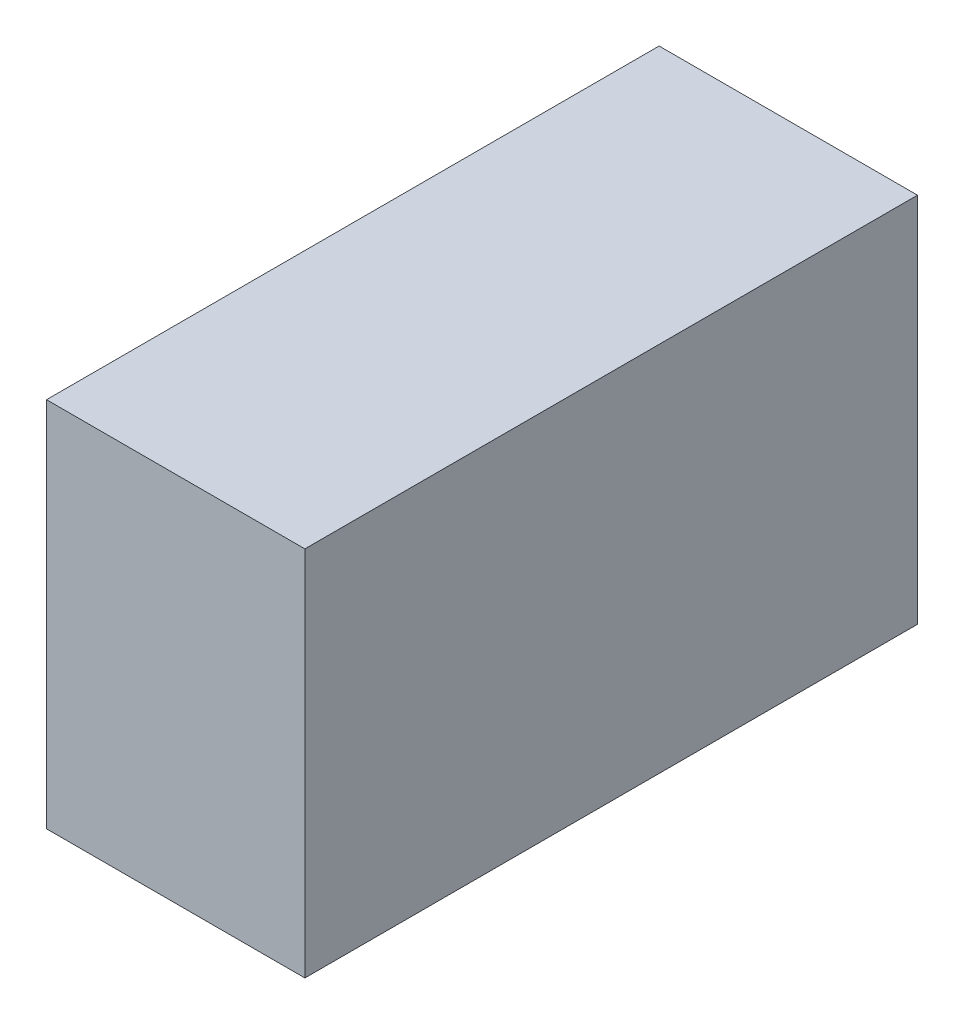
ISO-10303-21;
HEADER;
FILE_DESCRIPTION(('STEP AP214'),'2;1');
FILE_NAME('part.step','',(''),(''),'','','');
FILE_SCHEMA(('AUTOMOTIVE_DESIGN { 1 0 10303 214 1 1 1 1 }'));
ENDSEC;
DATA;
#1=APPLICATION_CONTEXT('core data for automotive mechanical design processes');
#2=APPLICATION_PROTOCOL_DEFINITION('international standard','automotive_design',2000,#1);
#3=PRODUCT_CONTEXT('',#1,'mechanical');
#4=PRODUCT('Part','Part','',(#3));
#5=PRODUCT_RELATED_PRODUCT_CATEGORY('part','',(#4));
#6=PRODUCT_DEFINITION_FORMATION('','',#4);
#7=PRODUCT_DEFINITION_CONTEXT('part definition',#1,'design');
#8=PRODUCT_DEFINITION('design','',#6,#7);
#9=PRODUCT_DEFINITION_SHAPE('','',#8);
#10=(LENGTH_UNIT() NAMED_UNIT(*) SI_UNIT(.MILLI.,.METRE.));
#11=(NAMED_UNIT(*) PLANE_ANGLE_UNIT() SI_UNIT($,.RADIAN.));
#12=(NAMED_UNIT(*) SI_UNIT($,.STERADIAN.) SOLID_ANGLE_UNIT());
#13=UNCERTAINTY_MEASURE_WITH_UNIT(LENGTH_MEASURE(1.E-05),#10,'distance_accuracy_value','');
#14=(GEOMETRIC_REPRESENTATION_CONTEXT(3) GLOBAL_UNCERTAINTY_ASSIGNED_CONTEXT((#13)) GLOBAL_UNIT_ASSIGNED_CONTEXT((#10,
#11,#12)) REPRESENTATION_CONTEXT('',''));
#15=CARTESIAN_POINT('',(0.,0.,0.));
#16=DIRECTION('',(0.,0.,1.));
#17=DIRECTION('',(1.,0.,0.));
#18=AXIS2_PLACEMENT_3D('',#15,#16,#17);
#19=CARTESIAN_POINT('',(0.,194.,0.));
#20=DIRECTION('',(1.,0.,0.));
#21=DIRECTION('',(0.,0.,-1.));
#22=AXIS2_PLACEMENT_3D('',#19,#20,#21);
#23=PLANE('',#22);
#24=DIRECTION('',(0.,0.,1.));
#25=VECTOR('',#24,1.);
#26=CARTESIAN_POINT('',(0.,0.,0.));
#27=LINE('',#26,#25);
#28=CARTESIAN_POINT('',(0.,0.,-319.786));
#29=VERTEX_POINT('',#28);
#30=CARTESIAN_POINT('',(0.,0.,0.));
#31=VERTEX_POINT('',#30);
#32=EDGE_CURVE('E104',#29,#31,#27,.T.);
#33=ORIENTED_EDGE('',*,*,#32,.T.);
#34=DIRECTION('',(0.,-1.,0.));
#35=VECTOR('',#34,1.);
#36=CARTESIAN_POINT('',(0.,194.,0.));
#37=LINE('',#36,#35);
#38=CARTESIAN_POINT('',(0.,194.,0.));
#39=VERTEX_POINT('',#38);
#40=EDGE_CURVE('E11',#39,#31,#37,.T.);
#41=ORIENTED_EDGE('',*,*,#40,.F.);
#42=DIRECTION('',(0.,0.,1.));
#43=VECTOR('',#42,1.);
#44=CARTESIAN_POINT('',(0.,194.,0.));
#45=LINE('',#44,#43);
#46=CARTESIAN_POINT('',(0.,194.,-319.786));
#47=VERTEX_POINT('',#46);
#48=EDGE_CURVE('E92',#47,#39,#45,.T.);
#49=ORIENTED_EDGE('',*,*,#48,.F.);
#50=DIRECTION('',(0.,-1.,0.));
#51=VECTOR('',#50,1.);
#52=CARTESIAN_POINT('',(0.,194.,-319.786));
#53=LINE('',#52,#51);
#54=EDGE_CURVE('E100',#47,#29,#53,.T.);
#55=ORIENTED_EDGE('',*,*,#54,.T.);
#56=EDGE_LOOP('',(#33,#41,#49,#55));
#57=FACE_BOUND('',#56,.T.);
#58=ADVANCED_FACE('F41',(#57),#23,.F.);
#59=CARTESIAN_POINT('',(0.,194.,0.));
#60=DIRECTION('',(0.,0.,-1.));
#61=DIRECTION('',(-1.,0.,0.));
#62=AXIS2_PLACEMENT_3D('',#59,#60,#61);
#63=PLANE('',#62);
#64=DIRECTION('',(1.,0.,0.));
#65=VECTOR('',#64,1.);
#66=CARTESIAN_POINT('',(0.,0.,0.));
#67=LINE('',#66,#65);
#68=CARTESIAN_POINT('',(134.874,0.,0.));
#69=VERTEX_POINT('',#68);
#70=EDGE_CURVE('E96',#31,#69,#67,.T.);
#71=ORIENTED_EDGE('',*,*,#70,.T.);
#72=DIRECTION('',(0.,-1.,0.));
#73=VECTOR('',#72,1.);
#74=CARTESIAN_POINT('',(134.874,194.,0.));
#75=LINE('',#74,#73);
#76=CARTESIAN_POINT('',(134.874,194.,0.));
#77=VERTEX_POINT('',#76);
#78=EDGE_CURVE('E49',#77,#69,#75,.T.);
#79=ORIENTED_EDGE('',*,*,#78,.F.);
#80=DIRECTION('',(1.,0.,0.));
#81=VECTOR('',#80,1.);
#82=CARTESIAN_POINT('',(0.,194.,0.));
#83=LINE('',#82,#81);
#84=EDGE_CURVE('E87',#39,#77,#83,.T.);
#85=ORIENTED_EDGE('',*,*,#84,.F.);
#86=ORIENTED_EDGE('',*,*,#40,.T.);
#87=EDGE_LOOP('',(#71,#79,#85,#86));
#88=FACE_BOUND('',#87,.T.);
#89=ADVANCED_FACE('F95',(#88),#63,.F.);
#90=CARTESIAN_POINT('',(134.874,194.,0.));
#91=DIRECTION('',(-1.,0.,0.));
#92=DIRECTION('',(0.,0.,1.));
#93=AXIS2_PLACEMENT_3D('',#90,#91,#92);
#94=PLANE('',#93);
#95=DIRECTION('',(0.,0.,-1.));
#96=VECTOR('',#95,1.);
#97=CARTESIAN_POINT('',(134.874,0.,0.));
#98=LINE('',#97,#96);
#99=CARTESIAN_POINT('',(134.874,0.,-319.786));
#100=VERTEX_POINT('',#99);
#101=EDGE_CURVE('E74',#69,#100,#98,.T.);
#102=ORIENTED_EDGE('',*,*,#101,.T.);
#103=DIRECTION('',(0.,-1.,0.));
#104=VECTOR('',#103,1.);
#105=CARTESIAN_POINT('',(134.874,194.,-319.786));
#106=LINE('',#105,#104);
#107=CARTESIAN_POINT('',(134.874,194.,-319.786));
#108=VERTEX_POINT('',#107);
#109=EDGE_CURVE('E97',#108,#100,#106,.T.);
#110=ORIENTED_EDGE('',*,*,#109,.F.);
#111=DIRECTION('',(0.,0.,-1.));
#112=VECTOR('',#111,1.);
#113=CARTESIAN_POINT('',(134.874,194.,0.));
#114=LINE('',#113,#112);
#115=EDGE_CURVE('E90',#77,#108,#114,.T.);
#116=ORIENTED_EDGE('',*,*,#115,.F.);
#117=ORIENTED_EDGE('',*,*,#78,.T.);
#118=EDGE_LOOP('',(#102,#110,#116,#117));
#119=FACE_BOUND('',#118,.T.);
#120=ADVANCED_FACE('F98',(#119),#94,.F.);
#121=CARTESIAN_POINT('',(0.,194.,-319.786));
#122=DIRECTION('',(0.,0.,1.));
#123=DIRECTION('',(1.,0.,0.));
#124=AXIS2_PLACEMENT_3D('',#121,#122,#123);
#125=PLANE('',#124);
#126=DIRECTION('',(-1.,0.,0.));
#127=VECTOR('',#126,1.);
#128=CARTESIAN_POINT('',(0.,0.,-319.786));
#129=LINE('',#128,#127);
#130=EDGE_CURVE('E80',#100,#29,#129,.T.);
#131=ORIENTED_EDGE('',*,*,#130,.T.);
#132=ORIENTED_EDGE('',*,*,#54,.F.);
#133=DIRECTION('',(-1.,0.,0.));
#134=VECTOR('',#133,1.);
#135=CARTESIAN_POINT('',(0.,194.,-319.786));
#136=LINE('',#135,#134);
#137=EDGE_CURVE('E57',#108,#47,#136,.T.);
#138=ORIENTED_EDGE('',*,*,#137,.F.);
#139=ORIENTED_EDGE('',*,*,#109,.T.);
#140=EDGE_LOOP('',(#131,#132,#138,#139));
#141=FACE_BOUND('',#140,.T.);
#142=ADVANCED_FACE('F111',(#141),#125,.F.);
#143=CARTESIAN_POINT('',(0.,194.,0.));
#144=DIRECTION('',(0.,-1.,0.));
#145=DIRECTION('',(0.,0.,-1.));
#146=AXIS2_PLACEMENT_3D('',#143,#144,#145);
#147=PLANE('',#146);
#148=ORIENTED_EDGE('',*,*,#48,.T.);
#149=ORIENTED_EDGE('',*,*,#84,.T.);
#150=ORIENTED_EDGE('',*,*,#115,.T.);
#151=ORIENTED_EDGE('',*,*,#137,.T.);
#152=EDGE_LOOP('',(#148,#149,#150,#151));
#153=FACE_BOUND('',#152,.T.);
#154=ADVANCED_FACE('F88',(#153),#147,.F.);
#155=CARTESIAN_POINT('',(0.,0.,0.));
#156=DIRECTION('',(0.,-1.,0.));
#157=DIRECTION('',(0.,0.,-1.));
#158=AXIS2_PLACEMENT_3D('',#155,#156,#157);
#159=PLANE('',#158);
#160=ORIENTED_EDGE('',*,*,#32,.F.);
#161=ORIENTED_EDGE('',*,*,#130,.F.);
#162=ORIENTED_EDGE('',*,*,#101,.F.);
#163=ORIENTED_EDGE('',*,*,#70,.F.);
#164=EDGE_LOOP('',(#160,#161,#162,#163));
#165=FACE_BOUND('',#164,.T.);
#166=ADVANCED_FACE('F114',(#165),#159,.T.);
#167=CLOSED_SHELL('',(#58,#89,#120,#142,#154,#166));
#168=MANIFOLD_SOLID_BREP('B2',#167);
#169=ADVANCED_BREP_SHAPE_REPRESENTATION('',(#18,#168),#14);
#170=SHAPE_DEFINITION_REPRESENTATION(#9,#169);
ENDSEC;
END-ISO-10303-21;
